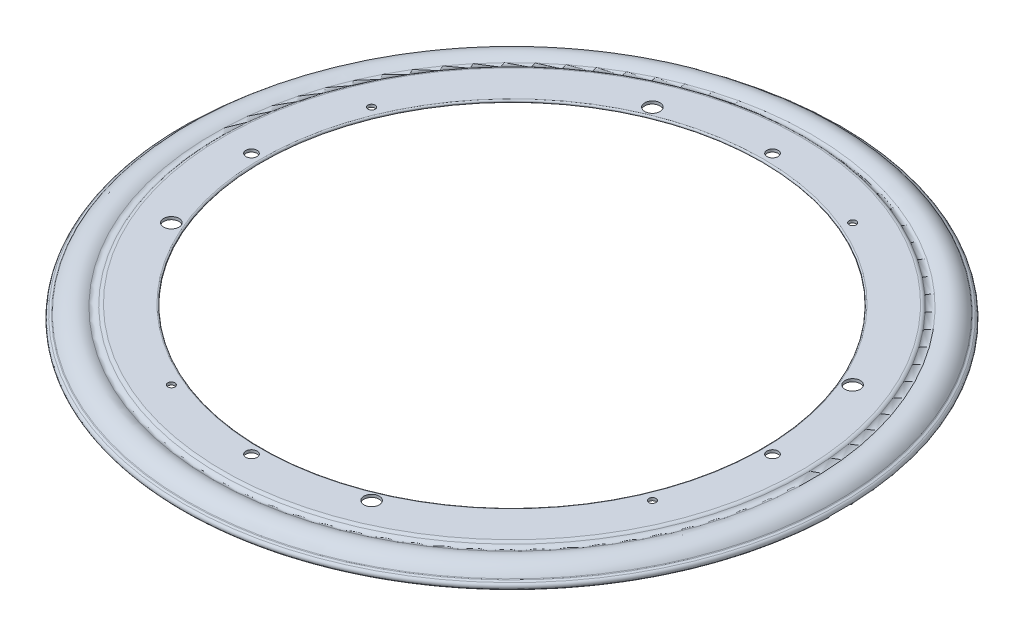
ISO-10303-21;
HEADER;
FILE_DESCRIPTION(('STEP AP214'),'2;1');
FILE_NAME('part.step','',(''),(''),'','','');
FILE_SCHEMA(('AUTOMOTIVE_DESIGN { 1 0 10303 214 1 1 1 1 }'));
ENDSEC;
DATA;
#1=APPLICATION_CONTEXT('core data for automotive mechanical design processes');
#2=APPLICATION_PROTOCOL_DEFINITION('international standard','automotive_design',2000,#1);
#3=PRODUCT_CONTEXT('',#1,'mechanical');
#4=PRODUCT('Part','Part','',(#3));
#5=PRODUCT_RELATED_PRODUCT_CATEGORY('part','',(#4));
#6=PRODUCT_DEFINITION_FORMATION('','',#4);
#7=PRODUCT_DEFINITION_CONTEXT('part definition',#1,'design');
#8=PRODUCT_DEFINITION('design','',#6,#7);
#9=PRODUCT_DEFINITION_SHAPE('','',#8);
#10=(LENGTH_UNIT() NAMED_UNIT(*) SI_UNIT(.MILLI.,.METRE.));
#11=(NAMED_UNIT(*) PLANE_ANGLE_UNIT() SI_UNIT($,.RADIAN.));
#12=(NAMED_UNIT(*) SI_UNIT($,.STERADIAN.) SOLID_ANGLE_UNIT());
#13=UNCERTAINTY_MEASURE_WITH_UNIT(LENGTH_MEASURE(1.E-05),#10,'distance_accuracy_value','');
#14=(GEOMETRIC_REPRESENTATION_CONTEXT(3) GLOBAL_UNCERTAINTY_ASSIGNED_CONTEXT((#13)) GLOBAL_UNIT_ASSIGNED_CONTEXT((#10,
#11,#12)) REPRESENTATION_CONTEXT('',''));
#15=CARTESIAN_POINT('',(0.,0.,0.));
#16=DIRECTION('',(0.,0.,1.));
#17=DIRECTION('',(1.,0.,0.));
#18=AXIS2_PLACEMENT_3D('',#15,#16,#17);
#19=CARTESIAN_POINT('',(0.,8.255,0.));
#20=DIRECTION('',(0.,-1.,0.));
#21=DIRECTION('',(0.,0.,-1.));
#22=AXIS2_PLACEMENT_3D('',#19,#20,#21);
#23=TOROIDAL_SURFACE('',#22,114.935,0.635);
#24=CARTESIAN_POINT('',(0.,8.89,0.));
#25=DIRECTION('',(0.,-1.,0.));
#26=DIRECTION('',(0.,0.,-1.));
#27=AXIS2_PLACEMENT_3D('',#24,#25,#26);
#28=CIRCLE('',#27,114.935);
#29=CARTESIAN_POINT('',(0.,8.89,-114.935));
#30=VERTEX_POINT('',#29);
#31=EDGE_CURVE('E10',#30,#30,#28,.T.);
#32=ORIENTED_EDGE('',*,*,#31,.F.);
#33=EDGE_LOOP('',(#32));
#34=FACE_BOUND('',#33,.T.);
#35=CARTESIAN_POINT('',(0.,7.62,0.));
#36=DIRECTION('',(0.,-1.,0.));
#37=DIRECTION('',(0.,0.,-1.));
#38=AXIS2_PLACEMENT_3D('',#35,#36,#37);
#39=CIRCLE('',#38,114.935);
#40=CARTESIAN_POINT('',(0.,7.62,-114.935));
#41=VERTEX_POINT('',#40);
#42=EDGE_CURVE('E77',#41,#41,#39,.T.);
#43=ORIENTED_EDGE('',*,*,#42,.T.);
#44=EDGE_LOOP('',(#43));
#45=FACE_BOUND('',#44,.T.);
#46=ADVANCED_FACE('F37',(#34,#45),#23,.T.);
#47=CARTESIAN_POINT('',(0.,8.89,121.793));
#48=DIRECTION('',(0.,-1.,0.));
#49=DIRECTION('',(0.,0.,-1.));
#50=AXIS2_PLACEMENT_3D('',#47,#48,#49);
#51=PLANE('',#50);
#52=CARTESIAN_POINT('',(-119.253,8.89,0.));
#53=DIRECTION('',(0.,1.,0.));
#54=DIRECTION('',(0.,0.,1.));
#55=AXIS2_PLACEMENT_3D('',#52,#53,#54);
#56=CIRCLE('',#55,2.54);
#57=CARTESIAN_POINT('',(-119.253,8.89,2.54));
#58=VERTEX_POINT('',#57);
#59=EDGE_CURVE('E111',#58,#58,#56,.T.);
#60=ORIENTED_EDGE('',*,*,#59,.F.);
#61=EDGE_LOOP('',(#60));
#62=FACE_BOUND('',#61,.T.);
#63=CARTESIAN_POINT('',(-110.095588021374,8.89,45.8283701131495));
#64=DIRECTION('',(0.,1.,0.));
#65=DIRECTION('',(0.,0.,1.));
#66=AXIS2_PLACEMENT_3D('',#63,#64,#65);
#67=CIRCLE('',#66,3.49249999999999);
#68=CARTESIAN_POINT('',(-110.095588021374,8.89,49.3208701131495));
#69=VERTEX_POINT('',#68);
#70=EDGE_CURVE('E119',#69,#69,#67,.T.);
#71=ORIENTED_EDGE('',*,*,#70,.F.);
#72=EDGE_LOOP('',(#71));
#73=FACE_BOUND('',#72,.T.);
#74=CARTESIAN_POINT('',(45.8283701131495,8.89,-110.095588021374));
#75=DIRECTION('',(0.,1.,0.));
#76=DIRECTION('',(0.,0.,1.));
#77=AXIS2_PLACEMENT_3D('',#74,#75,#76);
#78=CIRCLE('',#77,1.651);
#79=CARTESIAN_POINT('',(45.8283701131495,8.89,-108.444588021374));
#80=VERTEX_POINT('',#79);
#81=EDGE_CURVE('E125',#80,#80,#78,.T.);
#82=ORIENTED_EDGE('',*,*,#81,.F.);
#83=EDGE_LOOP('',(#82));
#84=FACE_BOUND('',#83,.T.);
#85=CARTESIAN_POINT('',(110.095588021374,8.89,-45.8283701131495));
#86=DIRECTION('',(0.,1.,0.));
#87=DIRECTION('',(0.,0.,1.));
#88=AXIS2_PLACEMENT_3D('',#85,#86,#87);
#89=CIRCLE('',#88,3.49250000000001);
#90=CARTESIAN_POINT('',(110.095588021374,8.89,-42.3358701131495));
#91=VERTEX_POINT('',#90);
#92=EDGE_CURVE('E94',#91,#91,#89,.T.);
#93=ORIENTED_EDGE('',*,*,#92,.F.);
#94=EDGE_LOOP('',(#93));
#95=FACE_BOUND('',#94,.T.);
#96=CARTESIAN_POINT('',(119.253,8.89,0.));
#97=DIRECTION('',(0.,1.,0.));
#98=DIRECTION('',(0.,0.,1.));
#99=AXIS2_PLACEMENT_3D('',#96,#97,#98);
#100=CIRCLE('',#99,2.54);
#101=CARTESIAN_POINT('',(119.253,8.89,2.54000000000001));
#102=VERTEX_POINT('',#101);
#103=EDGE_CURVE('E87',#102,#102,#100,.T.);
#104=ORIENTED_EDGE('',*,*,#103,.F.);
#105=EDGE_LOOP('',(#104));
#106=FACE_BOUND('',#105,.T.);
#107=CARTESIAN_POINT('',(110.095588021374,8.89,45.8283701131495));
#108=DIRECTION('',(0.,1.,0.));
#109=DIRECTION('',(0.,0.,1.));
#110=AXIS2_PLACEMENT_3D('',#107,#108,#109);
#111=CIRCLE('',#110,1.65100000000001);
#112=CARTESIAN_POINT('',(110.095588021374,8.89,47.4793701131495));
#113=VERTEX_POINT('',#112);
#114=EDGE_CURVE('E95',#113,#113,#111,.T.);
#115=ORIENTED_EDGE('',*,*,#114,.F.);
#116=EDGE_LOOP('',(#115));
#117=FACE_BOUND('',#116,.T.);
#118=CARTESIAN_POINT('',(45.8283701131495,8.89,110.095588021374));
#119=DIRECTION('',(0.,1.,0.));
#120=DIRECTION('',(0.,0.,1.));
#121=AXIS2_PLACEMENT_3D('',#118,#119,#120);
#122=CIRCLE('',#121,3.4925);
#123=CARTESIAN_POINT('',(45.8283701131495,8.89,113.588088021374));
#124=VERTEX_POINT('',#123);
#125=EDGE_CURVE('E101',#124,#124,#122,.T.);
#126=ORIENTED_EDGE('',*,*,#125,.F.);
#127=EDGE_LOOP('',(#126));
#128=FACE_BOUND('',#127,.T.);
#129=CARTESIAN_POINT('',(0.,8.89,119.253));
#130=DIRECTION('',(0.,1.,0.));
#131=DIRECTION('',(0.,0.,1.));
#132=AXIS2_PLACEMENT_3D('',#129,#130,#131);
#133=CIRCLE('',#132,2.53999999999997);
#134=CARTESIAN_POINT('',(0.,8.89,121.793));
#135=VERTEX_POINT('',#134);
#136=EDGE_CURVE('E86',#135,#135,#133,.T.);
#137=ORIENTED_EDGE('',*,*,#136,.F.);
#138=EDGE_LOOP('',(#137));
#139=FACE_BOUND('',#138,.T.);
#140=CARTESIAN_POINT('',(-45.8283701131494,8.89,-110.095588021374));
#141=DIRECTION('',(0.,1.,0.));
#142=DIRECTION('',(0.,0.,1.));
#143=AXIS2_PLACEMENT_3D('',#140,#141,#142);
#144=CIRCLE('',#143,3.4924999999999);
#145=CARTESIAN_POINT('',(-45.8283701131494,8.89,-106.603088021374));
#146=VERTEX_POINT('',#145);
#147=EDGE_CURVE('E142',#146,#146,#144,.T.);
#148=ORIENTED_EDGE('',*,*,#147,.F.);
#149=EDGE_LOOP('',(#148));
#150=FACE_BOUND('',#149,.T.);
#151=CARTESIAN_POINT('',(0.,8.89,-119.253));
#152=DIRECTION('',(0.,1.,0.));
#153=DIRECTION('',(0.,0.,1.));
#154=AXIS2_PLACEMENT_3D('',#151,#152,#153);
#155=CIRCLE('',#154,2.53999999999997);
#156=CARTESIAN_POINT('',(0.,8.89,-116.713));
#157=VERTEX_POINT('',#156);
#158=EDGE_CURVE('E135',#157,#157,#155,.T.);
#159=ORIENTED_EDGE('',*,*,#158,.F.);
#160=EDGE_LOOP('',(#159));
#161=FACE_BOUND('',#160,.T.);
#162=CARTESIAN_POINT('',(-110.095588021374,8.89,-45.8283701131494));
#163=DIRECTION('',(0.,1.,0.));
#164=DIRECTION('',(0.,0.,1.));
#165=AXIS2_PLACEMENT_3D('',#162,#163,#164);
#166=CIRCLE('',#165,1.65100000000001);
#167=CARTESIAN_POINT('',(-110.095588021374,8.89,-44.1773701131494));
#168=VERTEX_POINT('',#167);
#169=EDGE_CURVE('E118',#168,#168,#166,.T.);
#170=ORIENTED_EDGE('',*,*,#169,.F.);
#171=EDGE_LOOP('',(#170));
#172=FACE_BOUND('',#171,.T.);
#173=CARTESIAN_POINT('',(-45.8283701131494,8.89,110.095588021374));
#174=DIRECTION('',(0.,1.,0.));
#175=DIRECTION('',(0.,0.,1.));
#176=AXIS2_PLACEMENT_3D('',#173,#174,#175);
#177=CIRCLE('',#176,1.651);
#178=CARTESIAN_POINT('',(-45.8283701131494,8.89,111.746588021374));
#179=VERTEX_POINT('',#178);
#180=EDGE_CURVE('E83',#179,#179,#177,.T.);
#181=ORIENTED_EDGE('',*,*,#180,.F.);
#182=EDGE_LOOP('',(#181));
#183=FACE_BOUND('',#182,.T.);
#184=CARTESIAN_POINT('',(0.,8.89000000000001,0.));
#185=DIRECTION('',(0.,-1.,0.));
#186=DIRECTION('',(0.,0.,-1.));
#187=AXIS2_PLACEMENT_3D('',#184,#185,#186);
#188=CIRCLE('',#187,132.248430296176);
#189=CARTESIAN_POINT('',(0.,8.89000000000001,-132.248430296176));
#190=VERTEX_POINT('',#189);
#191=EDGE_CURVE('E43',#190,#190,#188,.T.);
#192=ORIENTED_EDGE('',*,*,#191,.F.);
#193=EDGE_LOOP('',(#192));
#194=FACE_BOUND('',#193,.T.);
#195=ORIENTED_EDGE('',*,*,#31,.T.);
#196=EDGE_LOOP('',(#195));
#197=FACE_BOUND('',#196,.T.);
#198=ADVANCED_FACE('F222',(#62,#73,#84,#95,#106,#117,#128,#139,#150,#161,#172,#183,#194,#197),
#51,.F.);
#199=CARTESIAN_POINT('',(0.,6.89,0.));
#200=DIRECTION('',(0.,-1.,0.));
#201=DIRECTION('',(0.,0.,-1.));
#202=AXIS2_PLACEMENT_3D('',#199,#200,#201);
#203=TOROIDAL_SURFACE('',#202,132.248430296176,1.99999999999995);
#204=CARTESIAN_POINT('',(0.,8.18567733544895,0.));
#205=DIRECTION('',(0.,-1.,0.));
#206=DIRECTION('',(0.,0.,-1.));
#207=AXIS2_PLACEMENT_3D('',#204,#205,#206);
#208=CIRCLE('',#207,133.771985428885);
#209=CARTESIAN_POINT('',(0.,8.18567733544895,-133.771985428885));
#210=VERTEX_POINT('',#209);
#211=EDGE_CURVE('E47',#210,#210,#208,.T.);
#212=ORIENTED_EDGE('',*,*,#211,.F.);
#213=EDGE_LOOP('',(#212));
#214=FACE_BOUND('',#213,.T.);
#215=ORIENTED_EDGE('',*,*,#191,.T.);
#216=EDGE_LOOP('',(#215));
#217=FACE_BOUND('',#216,.T.);
#218=ADVANCED_FACE('F217',(#214,#217),#203,.T.);
#219=CARTESIAN_POINT('',(0.,9.80527400476041,0.));
#220=DIRECTION('',(0.,-1.,0.));
#221=DIRECTION('',(0.,0.,-1.));
#222=AXIS2_PLACEMENT_3D('',#219,#220,#221);
#223=TOROIDAL_SURFACE('',#222,135.676429344771,2.5000000000002);
#224=CARTESIAN_POINT('',(0.,7.65310675174847,0.));
#225=DIRECTION('',(0.,-1.,0.));
#226=DIRECTION('',(0.,0.,-1.));
#227=AXIS2_PLACEMENT_3D('',#224,#225,#226);
#228=CIRCLE('',#227,136.948504859457);
#229=CARTESIAN_POINT('',(0.,7.65310675174847,-136.948504859457));
#230=VERTEX_POINT('',#229);
#231=EDGE_CURVE('E51',#230,#230,#228,.T.);
#232=ORIENTED_EDGE('',*,*,#231,.F.);
#233=EDGE_LOOP('',(#232));
#234=FACE_BOUND('',#233,.T.);
#235=ORIENTED_EDGE('',*,*,#211,.T.);
#236=EDGE_LOOP('',(#235));
#237=FACE_BOUND('',#236,.T.);
#238=ADVANCED_FACE('F211',(#234,#237),#223,.F.);
#239=CARTESIAN_POINT('',(0.,1.28030919199773E-11,0.));
#240=DIRECTION('',(0.,-1.,0.));
#241=DIRECTION('',(0.,0.,-1.));
#242=AXIS2_PLACEMENT_3D('',#239,#240,#241);
#243=TOROIDAL_SURFACE('',#242,141.472005389699,8.89000000003134);
#244=CARTESIAN_POINT('',(0.,5.06379836406525,0.));
#245=DIRECTION('',(0.,-1.,0.));
#246=DIRECTION('',(0.,0.,-1.));
#247=AXIS2_PLACEMENT_3D('',#244,#245,#246);
#248=CIRCLE('',#247,148.778854651096);
#249=CARTESIAN_POINT('',(0.,5.06379836406525,-148.778854651096));
#250=VERTEX_POINT('',#249);
#251=EDGE_CURVE('E56',#250,#250,#248,.T.);
#252=ORIENTED_EDGE('',*,*,#251,.F.);
#253=EDGE_LOOP('',(#252));
#254=FACE_BOUND('',#253,.T.);
#255=ORIENTED_EDGE('',*,*,#231,.T.);
#256=EDGE_LOOP('',(#255));
#257=FACE_BOUND('',#256,.T.);
#258=ADVANCED_FACE('F205',(#254,#257),#243,.T.);
#259=CARTESIAN_POINT('',(0.,5.46099999999883,0.));
#260=DIRECTION('',(0.,-1.,0.));
#261=DIRECTION('',(0.,0.,-1.));
#262=AXIS2_PLACEMENT_3D('',#259,#260,#261);
#263=TOROIDAL_SURFACE('',#262,149.352,0.697326846291542);
#264=CARTESIAN_POINT('',(0.,4.82599999999992,0.));
#265=DIRECTION('',(0.,-1.,0.));
#266=DIRECTION('',(0.,0.,-1.));
#267=AXIS2_PLACEMENT_3D('',#264,#265,#266);
#268=CIRCLE('',#267,149.063833849038);
#269=CARTESIAN_POINT('',(0.,4.82599999999992,-149.063833849038));
#270=VERTEX_POINT('',#269);
#271=EDGE_CURVE('E59',#270,#270,#268,.T.);
#272=ORIENTED_EDGE('',*,*,#271,.F.);
#273=EDGE_LOOP('',(#272));
#274=FACE_BOUND('',#273,.T.);
#275=ORIENTED_EDGE('',*,*,#251,.T.);
#276=EDGE_LOOP('',(#275));
#277=FACE_BOUND('',#276,.T.);
#278=ADVANCED_FACE('F199',(#274,#277),#263,.F.);
#279=CARTESIAN_POINT('',(0.,4.82599999999992,0.));
#280=DIRECTION('',(0.,-1.,0.));
#281=DIRECTION('',(0.,0.,-1.));
#282=AXIS2_PLACEMENT_3D('',#279,#280,#281);
#283=CONICAL_SURFACE('',#282,149.063833849038,1.14478270058614);
#284=CARTESIAN_POINT('',(0.,4.41393048878537,0.));
#285=DIRECTION('',(0.,-1.,0.));
#286=DIRECTION('',(0.,0.,-1.));
#287=AXIS2_PLACEMENT_3D('',#284,#285,#286);
#288=CIRCLE('',#287,149.971866033758);
#289=CARTESIAN_POINT('',(0.,4.41393048878537,-149.971866033758));
#290=VERTEX_POINT('',#289);
#291=EDGE_CURVE('E62',#290,#290,#288,.T.);
#292=ORIENTED_EDGE('',*,*,#291,.F.);
#293=EDGE_LOOP('',(#292));
#294=FACE_BOUND('',#293,.T.);
#295=ORIENTED_EDGE('',*,*,#271,.T.);
#296=EDGE_LOOP('',(#295));
#297=FACE_BOUND('',#296,.T.);
#298=ADVANCED_FACE('F193',(#294,#297),#283,.T.);
#299=CARTESIAN_POINT('',(0.,3.048,0.));
#300=DIRECTION('',(0.,-1.,0.));
#301=DIRECTION('',(0.,0.,-1.));
#302=AXIS2_PLACEMENT_3D('',#299,#300,#301);
#303=TOROIDAL_SURFACE('',#302,149.352,1.50000000000018);
#304=CARTESIAN_POINT('',(0.,3.20227301621739,0.));
#305=DIRECTION('',(0.,-1.,0.));
#306=DIRECTION('',(0.,0.,-1.));
#307=AXIS2_PLACEMENT_3D('',#304,#305,#306);
#308=CIRCLE('',#307,147.85995447909);
#309=CARTESIAN_POINT('',(0.,3.20227301621739,-147.85995447909));
#310=VERTEX_POINT('',#309);
#311=EDGE_CURVE('E65',#310,#310,#308,.T.);
#312=ORIENTED_EDGE('',*,*,#311,.F.);
#313=EDGE_LOOP('',(#312));
#314=FACE_BOUND('',#313,.T.);
#315=ORIENTED_EDGE('',*,*,#291,.T.);
#316=EDGE_LOOP('',(#315));
#317=FACE_BOUND('',#316,.T.);
#318=ADVANCED_FACE('F187',(#314,#317),#303,.T.);
#319=CARTESIAN_POINT('',(0.,3.51081904865215,0.));
#320=DIRECTION('',(0.,-1.,0.));
#321=DIRECTION('',(0.,0.,-1.));
#322=AXIS2_PLACEMENT_3D('',#319,#320,#321);
#323=TOROIDAL_SURFACE('',#322,144.87586343727,3.00000000000024);
#324=CARTESIAN_POINT('',(0.,5.66469576559487,0.));
#325=DIRECTION('',(0.,-1.,0.));
#326=DIRECTION('',(0.,0.,-1.));
#327=AXIS2_PLACEMENT_3D('',#324,#325,#326);
#328=CIRCLE('',#327,146.96411990816);
#329=CARTESIAN_POINT('',(0.,5.66469576559487,-146.96411990816));
#330=VERTEX_POINT('',#329);
#331=EDGE_CURVE('E68',#330,#330,#328,.T.);
#332=ORIENTED_EDGE('',*,*,#331,.F.);
#333=EDGE_LOOP('',(#332));
#334=FACE_BOUND('',#333,.T.);
#335=ORIENTED_EDGE('',*,*,#311,.T.);
#336=EDGE_LOOP('',(#335));
#337=FACE_BOUND('',#336,.T.);
#338=ADVANCED_FACE('F181',(#334,#337),#323,.F.);
#339=CARTESIAN_POINT('',(0.,1.28030919199773E-11,0.));
#340=DIRECTION('',(0.,-1.,0.));
#341=DIRECTION('',(0.,0.,-1.));
#342=AXIS2_PLACEMENT_3D('',#339,#340,#341);
#343=TOROIDAL_SURFACE('',#342,141.472005389699,7.89000000003126);
#344=CARTESIAN_POINT('',(0.,6.74960052100303,0.));
#345=DIRECTION('',(0.,-1.,0.));
#346=DIRECTION('',(0.,0.,-1.));
#347=AXIS2_PLACEMENT_3D('',#344,#345,#346);
#348=CIRCLE('',#347,137.386054728281);
#349=CARTESIAN_POINT('',(0.,6.74960052100303,-137.386054728281));
#350=VERTEX_POINT('',#349);
#351=EDGE_CURVE('E71',#350,#350,#348,.T.);
#352=ORIENTED_EDGE('',*,*,#351,.F.);
#353=EDGE_LOOP('',(#352));
#354=FACE_BOUND('',#353,.T.);
#355=ORIENTED_EDGE('',*,*,#331,.T.);
#356=EDGE_LOOP('',(#355));
#357=FACE_BOUND('',#356,.T.);
#358=ADVANCED_FACE('F175',(#354,#357),#343,.F.);
#359=CARTESIAN_POINT('',(0.,9.32187195928309,0.));
#360=DIRECTION('',(0.,-1.,0.));
#361=DIRECTION('',(0.,0.,-1.));
#362=AXIS2_PLACEMENT_3D('',#359,#360,#361);
#363=TOROIDAL_SURFACE('',#362,135.828899730455,3.00687745667245);
#364=CARTESIAN_POINT('',(0.,7.6199999999999,0.));
#365=DIRECTION('',(0.,-1.,0.));
#366=DIRECTION('',(0.,0.,-1.));
#367=AXIS2_PLACEMENT_3D('',#364,#365,#366);
#368=CIRCLE('',#367,133.35);
#369=CARTESIAN_POINT('',(0.,7.6199999999999,-133.35));
#370=VERTEX_POINT('',#369);
#371=EDGE_CURVE('E74',#370,#370,#368,.T.);
#372=ORIENTED_EDGE('',*,*,#371,.F.);
#373=EDGE_LOOP('',(#372));
#374=FACE_BOUND('',#373,.T.);
#375=ORIENTED_EDGE('',*,*,#351,.T.);
#376=EDGE_LOOP('',(#375));
#377=FACE_BOUND('',#376,.T.);
#378=ADVANCED_FACE('F160',(#374,#377),#363,.T.);
#379=CARTESIAN_POINT('',(0.,7.62,116.713));
#380=DIRECTION('',(0.,1.,0.));
#381=DIRECTION('',(0.,0.,1.));
#382=AXIS2_PLACEMENT_3D('',#379,#380,#381);
#383=PLANE('',#382);
#384=CARTESIAN_POINT('',(-119.253,7.62,0.));
#385=DIRECTION('',(0.,1.,0.));
#386=DIRECTION('',(0.,0.,1.));
#387=AXIS2_PLACEMENT_3D('',#384,#385,#386);
#388=CIRCLE('',#387,2.54);
#389=CARTESIAN_POINT('',(-119.253,7.62,2.54));
#390=VERTEX_POINT('',#389);
#391=EDGE_CURVE('E115',#390,#390,#388,.F.);
#392=ORIENTED_EDGE('',*,*,#391,.F.);
#393=EDGE_LOOP('',(#392));
#394=FACE_BOUND('',#393,.T.);
#395=CARTESIAN_POINT('',(-110.095588021374,7.62,45.8283701131495));
#396=DIRECTION('',(0.,1.,0.));
#397=DIRECTION('',(0.,0.,1.));
#398=AXIS2_PLACEMENT_3D('',#395,#396,#397);
#399=CIRCLE('',#398,3.49249999999999);
#400=CARTESIAN_POINT('',(-110.095588021374,7.62,49.3208701131495));
#401=VERTEX_POINT('',#400);
#402=EDGE_CURVE('E114',#401,#401,#399,.F.);
#403=ORIENTED_EDGE('',*,*,#402,.F.);
#404=EDGE_LOOP('',(#403));
#405=FACE_BOUND('',#404,.T.);
#406=CARTESIAN_POINT('',(45.8283701131495,7.62,-110.095588021374));
#407=DIRECTION('',(0.,1.,0.));
#408=DIRECTION('',(0.,0.,1.));
#409=AXIS2_PLACEMENT_3D('',#406,#407,#408);
#410=CIRCLE('',#409,1.651);
#411=CARTESIAN_POINT('',(45.8283701131495,7.62,-108.444588021374));
#412=VERTEX_POINT('',#411);
#413=EDGE_CURVE('E122',#412,#412,#410,.F.);
#414=ORIENTED_EDGE('',*,*,#413,.F.);
#415=EDGE_LOOP('',(#414));
#416=FACE_BOUND('',#415,.T.);
#417=CARTESIAN_POINT('',(110.095588021374,7.62,-45.8283701131495));
#418=DIRECTION('',(0.,1.,0.));
#419=DIRECTION('',(0.,0.,1.));
#420=AXIS2_PLACEMENT_3D('',#417,#418,#419);
#421=CIRCLE('',#420,3.49250000000001);
#422=CARTESIAN_POINT('',(110.095588021374,7.62,-42.3358701131495));
#423=VERTEX_POINT('',#422);
#424=EDGE_CURVE('E128',#423,#423,#421,.F.);
#425=ORIENTED_EDGE('',*,*,#424,.F.);
#426=EDGE_LOOP('',(#425));
#427=FACE_BOUND('',#426,.T.);
#428=CARTESIAN_POINT('',(119.253,7.62,0.));
#429=DIRECTION('',(0.,1.,0.));
#430=DIRECTION('',(0.,0.,1.));
#431=AXIS2_PLACEMENT_3D('',#428,#429,#430);
#432=CIRCLE('',#431,2.54);
#433=CARTESIAN_POINT('',(119.253,7.62,2.54000000000001));
#434=VERTEX_POINT('',#433);
#435=EDGE_CURVE('E91',#434,#434,#432,.F.);
#436=ORIENTED_EDGE('',*,*,#435,.F.);
#437=EDGE_LOOP('',(#436));
#438=FACE_BOUND('',#437,.T.);
#439=CARTESIAN_POINT('',(110.095588021374,7.62,45.8283701131495));
#440=DIRECTION('',(0.,1.,0.));
#441=DIRECTION('',(0.,0.,1.));
#442=AXIS2_PLACEMENT_3D('',#439,#440,#441);
#443=CIRCLE('',#442,1.65100000000001);
#444=CARTESIAN_POINT('',(110.095588021374,7.62,47.4793701131495));
#445=VERTEX_POINT('',#444);
#446=EDGE_CURVE('E90',#445,#445,#443,.F.);
#447=ORIENTED_EDGE('',*,*,#446,.F.);
#448=EDGE_LOOP('',(#447));
#449=FACE_BOUND('',#448,.T.);
#450=CARTESIAN_POINT('',(45.8283701131495,7.62,110.095588021374));
#451=DIRECTION('',(0.,1.,0.));
#452=DIRECTION('',(0.,0.,1.));
#453=AXIS2_PLACEMENT_3D('',#450,#451,#452);
#454=CIRCLE('',#453,3.4925);
#455=CARTESIAN_POINT('',(45.8283701131495,7.62,113.588088021374));
#456=VERTEX_POINT('',#455);
#457=EDGE_CURVE('E98',#456,#456,#454,.F.);
#458=ORIENTED_EDGE('',*,*,#457,.F.);
#459=EDGE_LOOP('',(#458));
#460=FACE_BOUND('',#459,.T.);
#461=CARTESIAN_POINT('',(0.,7.62,119.253));
#462=DIRECTION('',(0.,1.,0.));
#463=DIRECTION('',(0.,0.,1.));
#464=AXIS2_PLACEMENT_3D('',#461,#462,#463);
#465=CIRCLE('',#464,2.53999999999997);
#466=CARTESIAN_POINT('',(0.,7.62,121.793));
#467=VERTEX_POINT('',#466);
#468=EDGE_CURVE('E104',#467,#467,#465,.F.);
#469=ORIENTED_EDGE('',*,*,#468,.F.);
#470=EDGE_LOOP('',(#469));
#471=FACE_BOUND('',#470,.T.);
#472=CARTESIAN_POINT('',(-45.8283701131494,7.62,-110.095588021374));
#473=DIRECTION('',(0.,1.,0.));
#474=DIRECTION('',(0.,0.,1.));
#475=AXIS2_PLACEMENT_3D('',#472,#473,#474);
#476=CIRCLE('',#475,3.4924999999999);
#477=CARTESIAN_POINT('',(-45.8283701131494,7.62,-106.603088021374));
#478=VERTEX_POINT('',#477);
#479=EDGE_CURVE('E149',#478,#478,#476,.F.);
#480=ORIENTED_EDGE('',*,*,#479,.F.);
#481=EDGE_LOOP('',(#480));
#482=FACE_BOUND('',#481,.T.);
#483=CARTESIAN_POINT('',(0.,7.62,-119.253));
#484=DIRECTION('',(0.,1.,0.));
#485=DIRECTION('',(0.,0.,1.));
#486=AXIS2_PLACEMENT_3D('',#483,#484,#485);
#487=CIRCLE('',#486,2.53999999999997);
#488=CARTESIAN_POINT('',(0.,7.62,-116.713));
#489=VERTEX_POINT('',#488);
#490=EDGE_CURVE('E139',#489,#489,#487,.F.);
#491=ORIENTED_EDGE('',*,*,#490,.F.);
#492=EDGE_LOOP('',(#491));
#493=FACE_BOUND('',#492,.T.);
#494=CARTESIAN_POINT('',(-110.095588021374,7.62,-45.8283701131494));
#495=DIRECTION('',(0.,1.,0.));
#496=DIRECTION('',(0.,0.,1.));
#497=AXIS2_PLACEMENT_3D('',#494,#495,#496);
#498=CIRCLE('',#497,1.65100000000001);
#499=CARTESIAN_POINT('',(-110.095588021374,7.62,-44.1773701131494));
#500=VERTEX_POINT('',#499);
#501=EDGE_CURVE('E138',#500,#500,#498,.F.);
#502=ORIENTED_EDGE('',*,*,#501,.F.);
#503=EDGE_LOOP('',(#502));
#504=FACE_BOUND('',#503,.T.);
#505=CARTESIAN_POINT('',(-45.8283701131494,7.62,110.095588021374));
#506=DIRECTION('',(0.,1.,0.));
#507=DIRECTION('',(0.,0.,1.));
#508=AXIS2_PLACEMENT_3D('',#505,#506,#507);
#509=CIRCLE('',#508,1.651);
#510=CARTESIAN_POINT('',(-45.8283701131494,7.62,111.746588021374));
#511=VERTEX_POINT('',#510);
#512=EDGE_CURVE('E80',#511,#511,#509,.F.);
#513=ORIENTED_EDGE('',*,*,#512,.F.);
#514=EDGE_LOOP('',(#513));
#515=FACE_BOUND('',#514,.T.);
#516=ORIENTED_EDGE('',*,*,#42,.F.);
#517=EDGE_LOOP('',(#516));
#518=FACE_BOUND('',#517,.T.);
#519=ORIENTED_EDGE('',*,*,#371,.T.);
#520=EDGE_LOOP('',(#519));
#521=FACE_BOUND('',#520,.T.);
#522=ADVANCED_FACE('F156',(#394,#405,#416,#427,#438,#449,#460,#471,#482,#493,#504,#515,#518,
#521),#383,.F.);
#523=CARTESIAN_POINT('',(-45.8283701131494,-2.2582817331761,110.095588021374));
#524=DIRECTION('',(0.,1.,0.));
#525=DIRECTION('',(0.,0.,1.));
#526=AXIS2_PLACEMENT_3D('',#523,#524,#525);
#527=CYLINDRICAL_SURFACE('',#526,1.651);
#528=ORIENTED_EDGE('',*,*,#512,.T.);
#529=EDGE_LOOP('',(#528));
#530=FACE_BOUND('',#529,.T.);
#531=ORIENTED_EDGE('',*,*,#180,.T.);
#532=EDGE_LOOP('',(#531));
#533=FACE_BOUND('',#532,.T.);
#534=ADVANCED_FACE('F159',(#530,#533),#527,.F.);
#535=CARTESIAN_POINT('',(-110.095588021374,-2.2582817331761,-45.8283701131494));
#536=DIRECTION('',(0.,1.,0.));
#537=DIRECTION('',(0.,0.,1.));
#538=AXIS2_PLACEMENT_3D('',#535,#536,#537);
#539=CYLINDRICAL_SURFACE('',#538,1.65100000000001);
#540=ORIENTED_EDGE('',*,*,#501,.T.);
#541=EDGE_LOOP('',(#540));
#542=FACE_BOUND('',#541,.T.);
#543=ORIENTED_EDGE('',*,*,#169,.T.);
#544=EDGE_LOOP('',(#543));
#545=FACE_BOUND('',#544,.T.);
#546=ADVANCED_FACE('F304',(#542,#545),#539,.F.);
#547=CARTESIAN_POINT('',(0.,-2.2582817331761,-119.253));
#548=DIRECTION('',(0.,1.,0.));
#549=DIRECTION('',(0.,0.,1.));
#550=AXIS2_PLACEMENT_3D('',#547,#548,#549);
#551=CYLINDRICAL_SURFACE('',#550,2.53999999999997);
#552=ORIENTED_EDGE('',*,*,#490,.T.);
#553=EDGE_LOOP('',(#552));
#554=FACE_BOUND('',#553,.T.);
#555=ORIENTED_EDGE('',*,*,#158,.T.);
#556=EDGE_LOOP('',(#555));
#557=FACE_BOUND('',#556,.T.);
#558=ADVANCED_FACE('F314',(#554,#557),#551,.F.);
#559=CARTESIAN_POINT('',(-45.8283701131494,-2.2582817331761,-110.095588021374));
#560=DIRECTION('',(0.,1.,0.));
#561=DIRECTION('',(0.,0.,1.));
#562=AXIS2_PLACEMENT_3D('',#559,#560,#561);
#563=CYLINDRICAL_SURFACE('',#562,3.4924999999999);
#564=ORIENTED_EDGE('',*,*,#479,.T.);
#565=EDGE_LOOP('',(#564));
#566=FACE_BOUND('',#565,.T.);
#567=ORIENTED_EDGE('',*,*,#147,.T.);
#568=EDGE_LOOP('',(#567));
#569=FACE_BOUND('',#568,.T.);
#570=ADVANCED_FACE('F153',(#566,#569),#563,.F.);
#571=CARTESIAN_POINT('',(0.,-2.2582817331761,119.253));
#572=DIRECTION('',(0.,1.,0.));
#573=DIRECTION('',(0.,0.,1.));
#574=AXIS2_PLACEMENT_3D('',#571,#572,#573);
#575=CYLINDRICAL_SURFACE('',#574,2.53999999999997);
#576=ORIENTED_EDGE('',*,*,#468,.T.);
#577=EDGE_LOOP('',(#576));
#578=FACE_BOUND('',#577,.T.);
#579=ORIENTED_EDGE('',*,*,#136,.T.);
#580=EDGE_LOOP('',(#579));
#581=FACE_BOUND('',#580,.T.);
#582=ADVANCED_FACE('F333',(#578,#581),#575,.F.);
#583=CARTESIAN_POINT('',(45.8283701131495,-2.2582817331761,110.095588021374));
#584=DIRECTION('',(0.,1.,0.));
#585=DIRECTION('',(0.,0.,1.));
#586=AXIS2_PLACEMENT_3D('',#583,#584,#585);
#587=CYLINDRICAL_SURFACE('',#586,3.4925);
#588=ORIENTED_EDGE('',*,*,#457,.T.);
#589=EDGE_LOOP('',(#588));
#590=FACE_BOUND('',#589,.T.);
#591=ORIENTED_EDGE('',*,*,#125,.T.);
#592=EDGE_LOOP('',(#591));
#593=FACE_BOUND('',#592,.T.);
#594=ADVANCED_FACE('F342',(#590,#593),#587,.F.);
#595=CARTESIAN_POINT('',(110.095588021374,-2.2582817331761,45.8283701131495));
#596=DIRECTION('',(0.,1.,0.));
#597=DIRECTION('',(0.,0.,1.));
#598=AXIS2_PLACEMENT_3D('',#595,#596,#597);
#599=CYLINDRICAL_SURFACE('',#598,1.65100000000001);
#600=ORIENTED_EDGE('',*,*,#446,.T.);
#601=EDGE_LOOP('',(#600));
#602=FACE_BOUND('',#601,.T.);
#603=ORIENTED_EDGE('',*,*,#114,.T.);
#604=EDGE_LOOP('',(#603));
#605=FACE_BOUND('',#604,.T.);
#606=ADVANCED_FACE('F352',(#602,#605),#599,.F.);
#607=CARTESIAN_POINT('',(119.253,-2.2582817331761,0.));
#608=DIRECTION('',(0.,1.,0.));
#609=DIRECTION('',(0.,0.,1.));
#610=AXIS2_PLACEMENT_3D('',#607,#608,#609);
#611=CYLINDRICAL_SURFACE('',#610,2.54);
#612=ORIENTED_EDGE('',*,*,#435,.T.);
#613=EDGE_LOOP('',(#612));
#614=FACE_BOUND('',#613,.T.);
#615=ORIENTED_EDGE('',*,*,#103,.T.);
#616=EDGE_LOOP('',(#615));
#617=FACE_BOUND('',#616,.T.);
#618=ADVANCED_FACE('F362',(#614,#617),#611,.F.);
#619=CARTESIAN_POINT('',(110.095588021374,-2.2582817331761,-45.8283701131495));
#620=DIRECTION('',(0.,1.,0.));
#621=DIRECTION('',(0.,0.,1.));
#622=AXIS2_PLACEMENT_3D('',#619,#620,#621);
#623=CYLINDRICAL_SURFACE('',#622,3.49250000000001);
#624=ORIENTED_EDGE('',*,*,#424,.T.);
#625=EDGE_LOOP('',(#624));
#626=FACE_BOUND('',#625,.T.);
#627=ORIENTED_EDGE('',*,*,#92,.T.);
#628=EDGE_LOOP('',(#627));
#629=FACE_BOUND('',#628,.T.);
#630=ADVANCED_FACE('F372',(#626,#629),#623,.F.);
#631=CARTESIAN_POINT('',(45.8283701131495,-2.2582817331761,-110.095588021374));
#632=DIRECTION('',(0.,1.,0.));
#633=DIRECTION('',(0.,0.,1.));
#634=AXIS2_PLACEMENT_3D('',#631,#632,#633);
#635=CYLINDRICAL_SURFACE('',#634,1.651);
#636=ORIENTED_EDGE('',*,*,#413,.T.);
#637=EDGE_LOOP('',(#636));
#638=FACE_BOUND('',#637,.T.);
#639=ORIENTED_EDGE('',*,*,#81,.T.);
#640=EDGE_LOOP('',(#639));
#641=FACE_BOUND('',#640,.T.);
#642=ADVANCED_FACE('F382',(#638,#641),#635,.F.);
#643=CARTESIAN_POINT('',(-110.095588021374,-2.2582817331761,45.8283701131495));
#644=DIRECTION('',(0.,1.,0.));
#645=DIRECTION('',(0.,0.,1.));
#646=AXIS2_PLACEMENT_3D('',#643,#644,#645);
#647=CYLINDRICAL_SURFACE('',#646,3.49249999999999);
#648=ORIENTED_EDGE('',*,*,#402,.T.);
#649=EDGE_LOOP('',(#648));
#650=FACE_BOUND('',#649,.T.);
#651=ORIENTED_EDGE('',*,*,#70,.T.);
#652=EDGE_LOOP('',(#651));
#653=FACE_BOUND('',#652,.T.);
#654=ADVANCED_FACE('F392',(#650,#653),#647,.F.);
#655=CARTESIAN_POINT('',(-119.253,-2.2582817331761,0.));
#656=DIRECTION('',(0.,1.,0.));
#657=DIRECTION('',(0.,0.,1.));
#658=AXIS2_PLACEMENT_3D('',#655,#656,#657);
#659=CYLINDRICAL_SURFACE('',#658,2.54);
#660=ORIENTED_EDGE('',*,*,#391,.T.);
#661=EDGE_LOOP('',(#660));
#662=FACE_BOUND('',#661,.T.);
#663=ORIENTED_EDGE('',*,*,#59,.T.);
#664=EDGE_LOOP('',(#663));
#665=FACE_BOUND('',#664,.T.);
#666=ADVANCED_FACE('F402',(#662,#665),#659,.F.);
#667=CLOSED_SHELL('',(#46,#198,#218,#238,#258,#278,#298,#318,#338,#358,#378,#522,#534,#546,#558,
#570,#582,#594,#606,#618,#630,#642,#654,#666));
#668=MANIFOLD_SOLID_BREP('B2',#667);
#669=ADVANCED_BREP_SHAPE_REPRESENTATION('',(#18,#668),#14);
#670=SHAPE_DEFINITION_REPRESENTATION(#9,#669);
ENDSEC;
END-ISO-10303-21;
